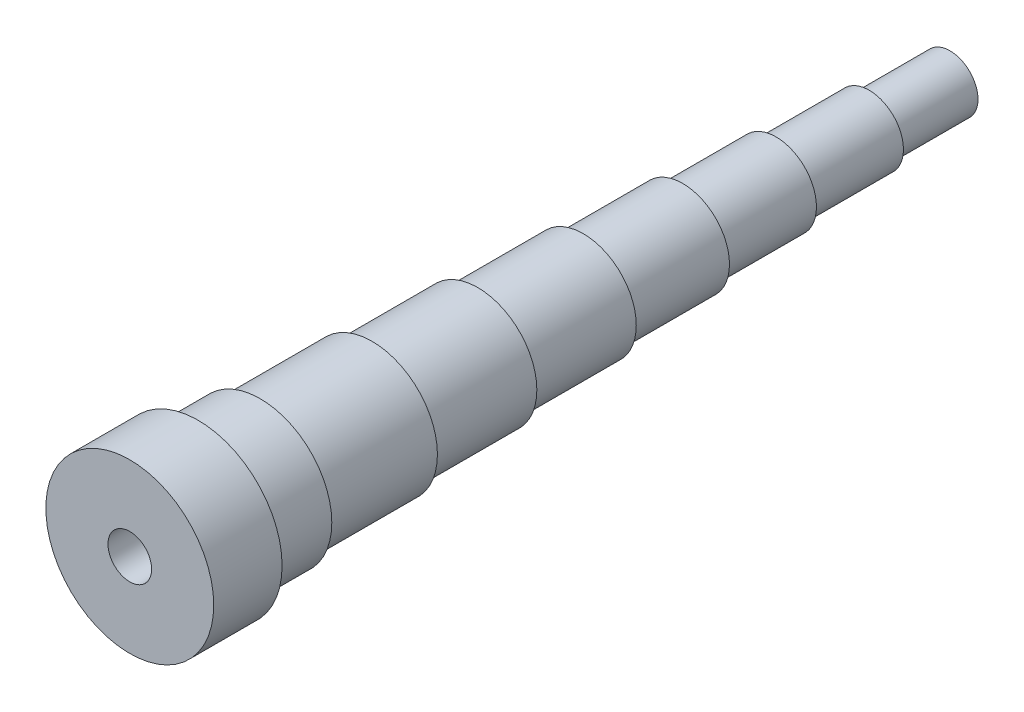
ISO-10303-21;
HEADER;
FILE_DESCRIPTION(('STEP AP214'),'2;1');
FILE_NAME('part.step','',(''),(''),'','','');
FILE_SCHEMA(('AUTOMOTIVE_DESIGN { 1 0 10303 214 1 1 1 1 }'));
ENDSEC;
DATA;
#1=APPLICATION_CONTEXT('core data for automotive mechanical design processes');
#2=APPLICATION_PROTOCOL_DEFINITION('international standard','automotive_design',2000,#1);
#3=PRODUCT_CONTEXT('',#1,'mechanical');
#4=PRODUCT('Part','Part','',(#3));
#5=PRODUCT_RELATED_PRODUCT_CATEGORY('part','',(#4));
#6=PRODUCT_DEFINITION_FORMATION('','',#4);
#7=PRODUCT_DEFINITION_CONTEXT('part definition',#1,'design');
#8=PRODUCT_DEFINITION('design','',#6,#7);
#9=PRODUCT_DEFINITION_SHAPE('','',#8);
#10=(LENGTH_UNIT() NAMED_UNIT(*) SI_UNIT(.MILLI.,.METRE.));
#11=(NAMED_UNIT(*) PLANE_ANGLE_UNIT() SI_UNIT($,.RADIAN.));
#12=(NAMED_UNIT(*) SI_UNIT($,.STERADIAN.) SOLID_ANGLE_UNIT());
#13=UNCERTAINTY_MEASURE_WITH_UNIT(LENGTH_MEASURE(1.E-05),#10,'distance_accuracy_value','');
#14=(GEOMETRIC_REPRESENTATION_CONTEXT(3) GLOBAL_UNCERTAINTY_ASSIGNED_CONTEXT((#13)) GLOBAL_UNIT_ASSIGNED_CONTEXT((#10,
#11,#12)) REPRESENTATION_CONTEXT('',''));
#15=CARTESIAN_POINT('',(0.,0.,0.));
#16=DIRECTION('',(0.,0.,1.));
#17=DIRECTION('',(1.,0.,0.));
#18=AXIS2_PLACEMENT_3D('',#15,#16,#17);
#19=CARTESIAN_POINT('',(0.,0.,19.9049289186182));
#20=DIRECTION('',(0.,0.,1.));
#21=DIRECTION('',(1.,0.,0.));
#22=AXIS2_PLACEMENT_3D('',#19,#20,#21);
#23=CYLINDRICAL_SURFACE('',#22,12.7);
#24=CARTESIAN_POINT('',(0.,0.,-213.40064));
#25=DIRECTION('',(0.,0.,1.));
#26=DIRECTION('',(1.,0.,0.));
#27=AXIS2_PLACEMENT_3D('',#24,#25,#26);
#28=CIRCLE('',#27,12.7);
#29=CARTESIAN_POINT('',(12.7,0.,-213.40064));
#30=VERTEX_POINT('',#29);
#31=EDGE_CURVE('E35',#30,#30,#28,.T.);
#32=ORIENTED_EDGE('',*,*,#31,.F.);
#33=EDGE_LOOP('',(#32));
#34=FACE_BOUND('',#33,.T.);
#35=CARTESIAN_POINT('',(0.,0.,264.03808));
#36=DIRECTION('',(0.,0.,1.));
#37=DIRECTION('',(1.,0.,0.));
#38=AXIS2_PLACEMENT_3D('',#35,#36,#37);
#39=CIRCLE('',#38,12.7);
#40=CARTESIAN_POINT('',(12.7,0.,264.03808));
#41=VERTEX_POINT('',#40);
#42=EDGE_CURVE('E10',#41,#41,#39,.T.);
#43=ORIENTED_EDGE('',*,*,#42,.T.);
#44=EDGE_LOOP('',(#43));
#45=FACE_BOUND('',#44,.T.);
#46=ADVANCED_FACE('F29',(#34,#45),#23,.F.);
#47=CARTESIAN_POINT('',(0.,12.7,-213.40064));
#48=DIRECTION('',(0.,0.,1.));
#49=DIRECTION('',(1.,0.,0.));
#50=AXIS2_PLACEMENT_3D('',#47,#48,#49);
#51=PLANE('',#50);
#52=CARTESIAN_POINT('',(0.,0.,-213.40064));
#53=DIRECTION('',(0.,0.,1.));
#54=DIRECTION('',(1.,0.,0.));
#55=AXIS2_PLACEMENT_3D('',#52,#53,#54);
#56=CIRCLE('',#55,16.31696);
#57=CARTESIAN_POINT('',(16.31696,0.,-213.40064));
#58=VERTEX_POINT('',#57);
#59=EDGE_CURVE('E39',#58,#58,#56,.T.);
#60=ORIENTED_EDGE('',*,*,#59,.F.);
#61=EDGE_LOOP('',(#60));
#62=FACE_BOUND('',#61,.T.);
#63=ORIENTED_EDGE('',*,*,#31,.T.);
#64=EDGE_LOOP('',(#63));
#65=FACE_BOUND('',#64,.T.);
#66=ADVANCED_FACE('F198',(#62,#65),#51,.F.);
#67=CARTESIAN_POINT('',(0.,0.,19.9049289186182));
#68=DIRECTION('',(0.,0.,1.));
#69=DIRECTION('',(1.,0.,0.));
#70=AXIS2_PLACEMENT_3D('',#67,#68,#69);
#71=CYLINDRICAL_SURFACE('',#70,16.31696);
#72=CARTESIAN_POINT('',(0.,0.,-166.38016));
#73=DIRECTION('',(0.,0.,1.));
#74=DIRECTION('',(1.,0.,0.));
#75=AXIS2_PLACEMENT_3D('',#72,#73,#74);
#76=CIRCLE('',#75,16.31696);
#77=CARTESIAN_POINT('',(16.31696,0.,-166.38016));
#78=VERTEX_POINT('',#77);
#79=EDGE_CURVE('E43',#78,#78,#76,.T.);
#80=ORIENTED_EDGE('',*,*,#79,.F.);
#81=EDGE_LOOP('',(#80));
#82=FACE_BOUND('',#81,.T.);
#83=ORIENTED_EDGE('',*,*,#59,.T.);
#84=EDGE_LOOP('',(#83));
#85=FACE_BOUND('',#84,.T.);
#86=ADVANCED_FACE('F192',(#82,#85),#71,.T.);
#87=CARTESIAN_POINT('',(0.,16.31696,-166.38016));
#88=DIRECTION('',(0.,0.,1.));
#89=DIRECTION('',(1.,0.,0.));
#90=AXIS2_PLACEMENT_3D('',#87,#88,#89);
#91=PLANE('',#90);
#92=CARTESIAN_POINT('',(0.,0.,-166.38016));
#93=DIRECTION('',(0.,0.,1.));
#94=DIRECTION('',(1.,0.,0.));
#95=AXIS2_PLACEMENT_3D('',#92,#93,#94);
#96=CIRCLE('',#95,19.93392);
#97=CARTESIAN_POINT('',(19.93392,0.,-166.38016));
#98=VERTEX_POINT('',#97);
#99=EDGE_CURVE('E48',#98,#98,#96,.T.);
#100=ORIENTED_EDGE('',*,*,#99,.F.);
#101=EDGE_LOOP('',(#100));
#102=FACE_BOUND('',#101,.T.);
#103=ORIENTED_EDGE('',*,*,#79,.T.);
#104=EDGE_LOOP('',(#103));
#105=FACE_BOUND('',#104,.T.);
#106=ADVANCED_FACE('F186',(#102,#105),#91,.F.);
#107=CARTESIAN_POINT('',(0.,0.,19.9049289186182));
#108=DIRECTION('',(0.,0.,1.));
#109=DIRECTION('',(1.,0.,0.));
#110=AXIS2_PLACEMENT_3D('',#107,#108,#109);
#111=CYLINDRICAL_SURFACE('',#110,19.93392);
#112=CARTESIAN_POINT('',(0.,0.,-112.12576));
#113=DIRECTION('',(0.,0.,1.));
#114=DIRECTION('',(1.,0.,0.));
#115=AXIS2_PLACEMENT_3D('',#112,#113,#114);
#116=CIRCLE('',#115,19.93392);
#117=CARTESIAN_POINT('',(19.93392,0.,-112.12576));
#118=VERTEX_POINT('',#117);
#119=EDGE_CURVE('E51',#118,#118,#116,.T.);
#120=ORIENTED_EDGE('',*,*,#119,.F.);
#121=EDGE_LOOP('',(#120));
#122=FACE_BOUND('',#121,.T.);
#123=ORIENTED_EDGE('',*,*,#99,.T.);
#124=EDGE_LOOP('',(#123));
#125=FACE_BOUND('',#124,.T.);
#126=ADVANCED_FACE('F180',(#122,#125),#111,.T.);
#127=CARTESIAN_POINT('',(0.,19.93392,-112.12576));
#128=DIRECTION('',(0.,0.,1.));
#129=DIRECTION('',(1.,0.,0.));
#130=AXIS2_PLACEMENT_3D('',#127,#128,#129);
#131=PLANE('',#130);
#132=CARTESIAN_POINT('',(0.,0.,-112.12576));
#133=DIRECTION('',(0.,0.,1.));
#134=DIRECTION('',(1.,0.,0.));
#135=AXIS2_PLACEMENT_3D('',#132,#133,#134);
#136=CIRCLE('',#135,23.55088);
#137=CARTESIAN_POINT('',(23.55088,0.,-112.12576));
#138=VERTEX_POINT('',#137);
#139=EDGE_CURVE('E54',#138,#138,#136,.T.);
#140=ORIENTED_EDGE('',*,*,#139,.F.);
#141=EDGE_LOOP('',(#140));
#142=FACE_BOUND('',#141,.T.);
#143=ORIENTED_EDGE('',*,*,#119,.T.);
#144=EDGE_LOOP('',(#143));
#145=FACE_BOUND('',#144,.T.);
#146=ADVANCED_FACE('F174',(#142,#145),#131,.F.);
#147=CARTESIAN_POINT('',(0.,0.,19.9049289186182));
#148=DIRECTION('',(0.,0.,1.));
#149=DIRECTION('',(1.,0.,0.));
#150=AXIS2_PLACEMENT_3D('',#147,#148,#149);
#151=CYLINDRICAL_SURFACE('',#150,23.55088);
#152=CARTESIAN_POINT('',(0.,0.,-57.87136));
#153=DIRECTION('',(0.,0.,1.));
#154=DIRECTION('',(1.,0.,0.));
#155=AXIS2_PLACEMENT_3D('',#152,#153,#154);
#156=CIRCLE('',#155,23.55088);
#157=CARTESIAN_POINT('',(23.55088,0.,-57.87136));
#158=VERTEX_POINT('',#157);
#159=EDGE_CURVE('E57',#158,#158,#156,.T.);
#160=ORIENTED_EDGE('',*,*,#159,.F.);
#161=EDGE_LOOP('',(#160));
#162=FACE_BOUND('',#161,.T.);
#163=ORIENTED_EDGE('',*,*,#139,.T.);
#164=EDGE_LOOP('',(#163));
#165=FACE_BOUND('',#164,.T.);
#166=ADVANCED_FACE('F168',(#162,#165),#151,.T.);
#167=CARTESIAN_POINT('',(0.,23.55088,-57.87136));
#168=DIRECTION('',(0.,0.,1.));
#169=DIRECTION('',(1.,0.,0.));
#170=AXIS2_PLACEMENT_3D('',#167,#168,#169);
#171=PLANE('',#170);
#172=CARTESIAN_POINT('',(0.,0.,-57.87136));
#173=DIRECTION('',(0.,0.,1.));
#174=DIRECTION('',(1.,0.,0.));
#175=AXIS2_PLACEMENT_3D('',#172,#173,#174);
#176=CIRCLE('',#175,27.16784);
#177=CARTESIAN_POINT('',(27.16784,0.,-57.87136));
#178=VERTEX_POINT('',#177);
#179=EDGE_CURVE('E60',#178,#178,#176,.T.);
#180=ORIENTED_EDGE('',*,*,#179,.F.);
#181=EDGE_LOOP('',(#180));
#182=FACE_BOUND('',#181,.T.);
#183=ORIENTED_EDGE('',*,*,#159,.T.);
#184=EDGE_LOOP('',(#183));
#185=FACE_BOUND('',#184,.T.);
#186=ADVANCED_FACE('F162',(#182,#185),#171,.F.);
#187=CARTESIAN_POINT('',(0.,0.,19.9049289186182));
#188=DIRECTION('',(0.,0.,1.));
#189=DIRECTION('',(1.,0.,0.));
#190=AXIS2_PLACEMENT_3D('',#187,#188,#189);
#191=CYLINDRICAL_SURFACE('',#190,27.16784);
#192=CARTESIAN_POINT('',(0.,0.,0.));
#193=DIRECTION('',(0.,0.,1.));
#194=DIRECTION('',(1.,0.,0.));
#195=AXIS2_PLACEMENT_3D('',#192,#193,#194);
#196=CIRCLE('',#195,27.16784);
#197=CARTESIAN_POINT('',(27.16784,0.,0.));
#198=VERTEX_POINT('',#197);
#199=EDGE_CURVE('E63',#198,#198,#196,.T.);
#200=ORIENTED_EDGE('',*,*,#199,.F.);
#201=EDGE_LOOP('',(#200));
#202=FACE_BOUND('',#201,.T.);
#203=ORIENTED_EDGE('',*,*,#179,.T.);
#204=EDGE_LOOP('',(#203));
#205=FACE_BOUND('',#204,.T.);
#206=ADVANCED_FACE('F156',(#202,#205),#191,.T.);
#207=CARTESIAN_POINT('',(0.,27.16784,0.));
#208=DIRECTION('',(0.,0.,1.));
#209=DIRECTION('',(1.,0.,0.));
#210=AXIS2_PLACEMENT_3D('',#207,#208,#209);
#211=PLANE('',#210);
#212=CARTESIAN_POINT('',(0.,0.,0.));
#213=DIRECTION('',(0.,0.,1.));
#214=DIRECTION('',(1.,0.,0.));
#215=AXIS2_PLACEMENT_3D('',#212,#213,#214);
#216=CIRCLE('',#215,30.7848);
#217=CARTESIAN_POINT('',(30.7848,0.,0.));
#218=VERTEX_POINT('',#217);
#219=EDGE_CURVE('E66',#218,#218,#216,.T.);
#220=ORIENTED_EDGE('',*,*,#219,.F.);
#221=EDGE_LOOP('',(#220));
#222=FACE_BOUND('',#221,.T.);
#223=ORIENTED_EDGE('',*,*,#199,.T.);
#224=EDGE_LOOP('',(#223));
#225=FACE_BOUND('',#224,.T.);
#226=ADVANCED_FACE('F150',(#222,#225),#211,.F.);
#227=CARTESIAN_POINT('',(0.,0.,19.9049289186182));
#228=DIRECTION('',(0.,0.,1.));
#229=DIRECTION('',(1.,0.,0.));
#230=AXIS2_PLACEMENT_3D('',#227,#228,#229);
#231=CYLINDRICAL_SURFACE('',#230,30.7848);
#232=CARTESIAN_POINT('',(0.,0.,61.48832));
#233=DIRECTION('',(0.,0.,1.));
#234=DIRECTION('',(1.,0.,0.));
#235=AXIS2_PLACEMENT_3D('',#232,#233,#234);
#236=CIRCLE('',#235,30.7848);
#237=CARTESIAN_POINT('',(30.7848,0.,61.48832));
#238=VERTEX_POINT('',#237);
#239=EDGE_CURVE('E69',#238,#238,#236,.T.);
#240=ORIENTED_EDGE('',*,*,#239,.F.);
#241=EDGE_LOOP('',(#240));
#242=FACE_BOUND('',#241,.T.);
#243=ORIENTED_EDGE('',*,*,#219,.T.);
#244=EDGE_LOOP('',(#243));
#245=FACE_BOUND('',#244,.T.);
#246=ADVANCED_FACE('F144',(#242,#245),#231,.T.);
#247=CARTESIAN_POINT('',(0.,30.7848,61.48832));
#248=DIRECTION('',(0.,0.,1.));
#249=DIRECTION('',(1.,0.,0.));
#250=AXIS2_PLACEMENT_3D('',#247,#248,#249);
#251=PLANE('',#250);
#252=CARTESIAN_POINT('',(0.,0.,61.48832));
#253=DIRECTION('',(0.,0.,1.));
#254=DIRECTION('',(1.,0.,0.));
#255=AXIS2_PLACEMENT_3D('',#252,#253,#254);
#256=CIRCLE('',#255,34.40176);
#257=CARTESIAN_POINT('',(34.40176,0.,61.48832));
#258=VERTEX_POINT('',#257);
#259=EDGE_CURVE('E72',#258,#258,#256,.T.);
#260=ORIENTED_EDGE('',*,*,#259,.F.);
#261=EDGE_LOOP('',(#260));
#262=FACE_BOUND('',#261,.T.);
#263=ORIENTED_EDGE('',*,*,#239,.T.);
#264=EDGE_LOOP('',(#263));
#265=FACE_BOUND('',#264,.T.);
#266=ADVANCED_FACE('F138',(#262,#265),#251,.F.);
#267=CARTESIAN_POINT('',(0.,0.,19.9049289186182));
#268=DIRECTION('',(0.,0.,1.));
#269=DIRECTION('',(1.,0.,0.));
#270=AXIS2_PLACEMENT_3D('',#267,#268,#269);
#271=CYLINDRICAL_SURFACE('',#270,34.40176);
#272=CARTESIAN_POINT('',(0.,0.,122.97664));
#273=DIRECTION('',(0.,0.,1.));
#274=DIRECTION('',(1.,0.,0.));
#275=AXIS2_PLACEMENT_3D('',#272,#273,#274);
#276=CIRCLE('',#275,34.40176);
#277=CARTESIAN_POINT('',(34.40176,0.,122.97664));
#278=VERTEX_POINT('',#277);
#279=EDGE_CURVE('E75',#278,#278,#276,.T.);
#280=ORIENTED_EDGE('',*,*,#279,.F.);
#281=EDGE_LOOP('',(#280));
#282=FACE_BOUND('',#281,.T.);
#283=ORIENTED_EDGE('',*,*,#259,.T.);
#284=EDGE_LOOP('',(#283));
#285=FACE_BOUND('',#284,.T.);
#286=ADVANCED_FACE('F132',(#282,#285),#271,.T.);
#287=CARTESIAN_POINT('',(0.,34.40176,122.97664));
#288=DIRECTION('',(0.,0.,1.));
#289=DIRECTION('',(1.,0.,0.));
#290=AXIS2_PLACEMENT_3D('',#287,#288,#289);
#291=PLANE('',#290);
#292=CARTESIAN_POINT('',(0.,0.,122.97664));
#293=DIRECTION('',(0.,0.,1.));
#294=DIRECTION('',(1.,0.,0.));
#295=AXIS2_PLACEMENT_3D('',#292,#293,#294);
#296=CIRCLE('',#295,38.01872);
#297=CARTESIAN_POINT('',(38.01872,0.,122.97664));
#298=VERTEX_POINT('',#297);
#299=EDGE_CURVE('E78',#298,#298,#296,.T.);
#300=ORIENTED_EDGE('',*,*,#299,.F.);
#301=EDGE_LOOP('',(#300));
#302=FACE_BOUND('',#301,.T.);
#303=ORIENTED_EDGE('',*,*,#279,.T.);
#304=EDGE_LOOP('',(#303));
#305=FACE_BOUND('',#304,.T.);
#306=ADVANCED_FACE('F126',(#302,#305),#291,.F.);
#307=CARTESIAN_POINT('',(0.,0.,19.9049289186182));
#308=DIRECTION('',(0.,0.,1.));
#309=DIRECTION('',(1.,0.,0.));
#310=AXIS2_PLACEMENT_3D('',#307,#308,#309);
#311=CYLINDRICAL_SURFACE('',#310,38.01872);
#312=CARTESIAN_POINT('',(0.,0.,188.08192));
#313=DIRECTION('',(0.,0.,1.));
#314=DIRECTION('',(1.,0.,0.));
#315=AXIS2_PLACEMENT_3D('',#312,#313,#314);
#316=CIRCLE('',#315,38.01872);
#317=CARTESIAN_POINT('',(38.01872,0.,188.08192));
#318=VERTEX_POINT('',#317);
#319=EDGE_CURVE('E81',#318,#318,#316,.T.);
#320=ORIENTED_EDGE('',*,*,#319,.F.);
#321=EDGE_LOOP('',(#320));
#322=FACE_BOUND('',#321,.T.);
#323=ORIENTED_EDGE('',*,*,#299,.T.);
#324=EDGE_LOOP('',(#323));
#325=FACE_BOUND('',#324,.T.);
#326=ADVANCED_FACE('F120',(#322,#325),#311,.T.);
#327=CARTESIAN_POINT('',(0.,38.01872,188.08192));
#328=DIRECTION('',(0.,0.,1.));
#329=DIRECTION('',(1.,0.,0.));
#330=AXIS2_PLACEMENT_3D('',#327,#328,#329);
#331=PLANE('',#330);
#332=CARTESIAN_POINT('',(0.,0.,188.08192));
#333=DIRECTION('',(0.,0.,1.));
#334=DIRECTION('',(1.,0.,0.));
#335=AXIS2_PLACEMENT_3D('',#332,#333,#334);
#336=CIRCLE('',#335,41.63568);
#337=CARTESIAN_POINT('',(41.63568,0.,188.08192));
#338=VERTEX_POINT('',#337);
#339=EDGE_CURVE('E84',#338,#338,#336,.T.);
#340=ORIENTED_EDGE('',*,*,#339,.F.);
#341=EDGE_LOOP('',(#340));
#342=FACE_BOUND('',#341,.T.);
#343=ORIENTED_EDGE('',*,*,#319,.T.);
#344=EDGE_LOOP('',(#343));
#345=FACE_BOUND('',#344,.T.);
#346=ADVANCED_FACE('F114',(#342,#345),#331,.F.);
#347=CARTESIAN_POINT('',(0.,0.,19.9049289186182));
#348=DIRECTION('',(0.,0.,1.));
#349=DIRECTION('',(1.,0.,0.));
#350=AXIS2_PLACEMENT_3D('',#347,#348,#349);
#351=CYLINDRICAL_SURFACE('',#350,41.63568);
#352=CARTESIAN_POINT('',(0.,0.,224.25152));
#353=DIRECTION('',(0.,0.,1.));
#354=DIRECTION('',(1.,0.,0.));
#355=AXIS2_PLACEMENT_3D('',#352,#353,#354);
#356=CIRCLE('',#355,41.6356799999999);
#357=CARTESIAN_POINT('',(41.6356799999999,0.,224.25152));
#358=VERTEX_POINT('',#357);
#359=EDGE_CURVE('E87',#358,#358,#356,.T.);
#360=ORIENTED_EDGE('',*,*,#359,.F.);
#361=EDGE_LOOP('',(#360));
#362=FACE_BOUND('',#361,.T.);
#363=ORIENTED_EDGE('',*,*,#339,.T.);
#364=EDGE_LOOP('',(#363));
#365=FACE_BOUND('',#364,.T.);
#366=ADVANCED_FACE('F108',(#362,#365),#351,.T.);
#367=CARTESIAN_POINT('',(0.,41.6356799999999,224.25152));
#368=DIRECTION('',(0.,0.,1.));
#369=DIRECTION('',(1.,0.,0.));
#370=AXIS2_PLACEMENT_3D('',#367,#368,#369);
#371=PLANE('',#370);
#372=CARTESIAN_POINT('',(0.,0.,224.25152));
#373=DIRECTION('',(0.,0.,1.));
#374=DIRECTION('',(1.,0.,0.));
#375=AXIS2_PLACEMENT_3D('',#372,#373,#374);
#376=CIRCLE('',#375,48.8695999999999);
#377=CARTESIAN_POINT('',(48.8695999999999,0.,224.25152));
#378=VERTEX_POINT('',#377);
#379=EDGE_CURVE('E90',#378,#378,#376,.T.);
#380=ORIENTED_EDGE('',*,*,#379,.F.);
#381=EDGE_LOOP('',(#380));
#382=FACE_BOUND('',#381,.T.);
#383=ORIENTED_EDGE('',*,*,#359,.T.);
#384=EDGE_LOOP('',(#383));
#385=FACE_BOUND('',#384,.T.);
#386=ADVANCED_FACE('F102',(#382,#385),#371,.F.);
#387=CARTESIAN_POINT('',(0.,0.,19.9049289186182));
#388=DIRECTION('',(0.,0.,1.));
#389=DIRECTION('',(1.,0.,0.));
#390=AXIS2_PLACEMENT_3D('',#387,#388,#389);
#391=CYLINDRICAL_SURFACE('',#390,48.8695999999999);
#392=CARTESIAN_POINT('',(0.,0.,264.03808));
#393=DIRECTION('',(0.,0.,1.));
#394=DIRECTION('',(1.,0.,0.));
#395=AXIS2_PLACEMENT_3D('',#392,#393,#394);
#396=CIRCLE('',#395,48.8695999999999);
#397=CARTESIAN_POINT('',(48.8695999999999,0.,264.03808));
#398=VERTEX_POINT('',#397);
#399=EDGE_CURVE('E93',#398,#398,#396,.T.);
#400=ORIENTED_EDGE('',*,*,#399,.F.);
#401=EDGE_LOOP('',(#400));
#402=FACE_BOUND('',#401,.T.);
#403=ORIENTED_EDGE('',*,*,#379,.T.);
#404=EDGE_LOOP('',(#403));
#405=FACE_BOUND('',#404,.T.);
#406=ADVANCED_FACE('F99',(#402,#405),#391,.T.);
#407=CARTESIAN_POINT('',(0.,38.01872,264.03808));
#408=DIRECTION('',(0.,0.,-1.));
#409=DIRECTION('',(-1.,0.,0.));
#410=AXIS2_PLACEMENT_3D('',#407,#408,#409);
#411=PLANE('',#410);
#412=ORIENTED_EDGE('',*,*,#42,.F.);
#413=EDGE_LOOP('',(#412));
#414=FACE_BOUND('',#413,.T.);
#415=ORIENTED_EDGE('',*,*,#399,.T.);
#416=EDGE_LOOP('',(#415));
#417=FACE_BOUND('',#416,.T.);
#418=ADVANCED_FACE('F97',(#414,#417),#411,.F.);
#419=CLOSED_SHELL('',(#46,#66,#86,#106,#126,#146,#166,#186,#206,#226,#246,#266,#286,#306,#326,
#346,#366,#386,#406,#418));
#420=MANIFOLD_SOLID_BREP('B2',#419);
#421=ADVANCED_BREP_SHAPE_REPRESENTATION('',(#18,#420),#14);
#422=SHAPE_DEFINITION_REPRESENTATION(#9,#421);
ENDSEC;
END-ISO-10303-21;
